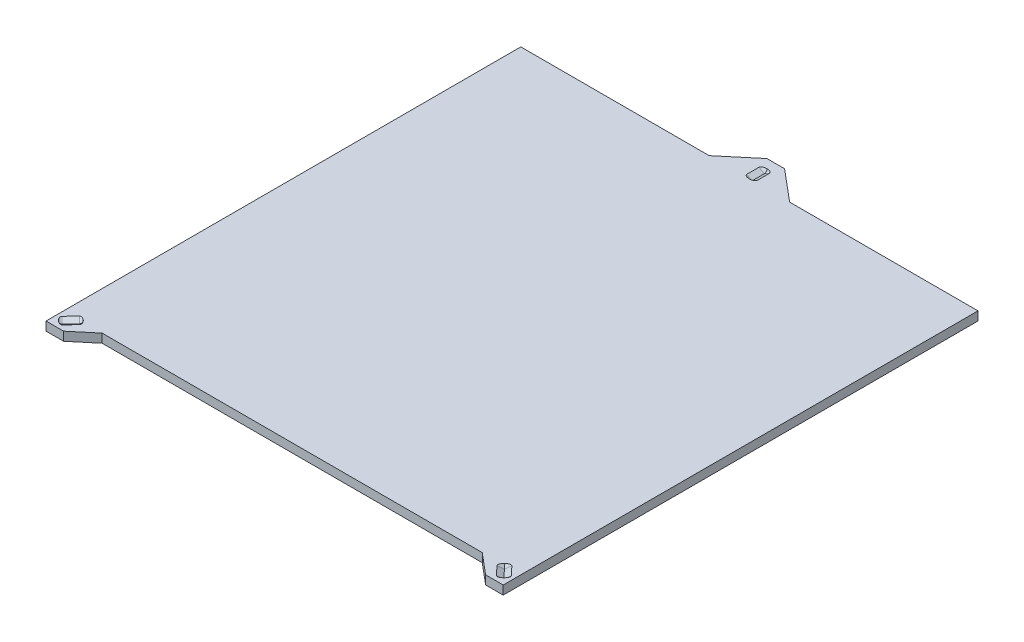
ISO-10303-21;
HEADER;
FILE_DESCRIPTION(('STEP AP214'),'2;1');
FILE_NAME('part.step','',(''),(''),'','','');
FILE_SCHEMA(('AUTOMOTIVE_DESIGN { 1 0 10303 214 1 1 1 1 }'));
ENDSEC;
DATA;
#1=APPLICATION_CONTEXT('core data for automotive mechanical design processes');
#2=APPLICATION_PROTOCOL_DEFINITION('international standard','automotive_design',2000,#1);
#3=PRODUCT_CONTEXT('',#1,'mechanical');
#4=PRODUCT('Part','Part','',(#3));
#5=PRODUCT_RELATED_PRODUCT_CATEGORY('part','',(#4));
#6=PRODUCT_DEFINITION_FORMATION('','',#4);
#7=PRODUCT_DEFINITION_CONTEXT('part definition',#1,'design');
#8=PRODUCT_DEFINITION('design','',#6,#7);
#9=PRODUCT_DEFINITION_SHAPE('','',#8);
#10=(LENGTH_UNIT() NAMED_UNIT(*) SI_UNIT(.MILLI.,.METRE.));
#11=(NAMED_UNIT(*) PLANE_ANGLE_UNIT() SI_UNIT($,.RADIAN.));
#12=(NAMED_UNIT(*) SI_UNIT($,.STERADIAN.) SOLID_ANGLE_UNIT());
#13=UNCERTAINTY_MEASURE_WITH_UNIT(LENGTH_MEASURE(1.E-05),#10,'distance_accuracy_value','');
#14=(GEOMETRIC_REPRESENTATION_CONTEXT(3) GLOBAL_UNCERTAINTY_ASSIGNED_CONTEXT((#13)) GLOBAL_UNIT_ASSIGNED_CONTEXT((#10,
#11,#12)) REPRESENTATION_CONTEXT('',''));
#15=CARTESIAN_POINT('',(0.,0.,0.));
#16=DIRECTION('',(0.,0.,1.));
#17=DIRECTION('',(1.,0.,0.));
#18=AXIS2_PLACEMENT_3D('',#15,#16,#17);
#19=CARTESIAN_POINT('',(0.,10.,0.));
#20=DIRECTION('',(0.,1.,0.));
#21=DIRECTION('',(0.,0.,1.));
#22=AXIS2_PLACEMENT_3D('',#19,#20,#21);
#23=PLANE('',#22);
#24=DIRECTION('',(0.,0.,1.));
#25=VECTOR('',#24,1.);
#26=CARTESIAN_POINT('',(-260.,10.,-260.));
#27=LINE('',#26,#25);
#28=CARTESIAN_POINT('',(-260.,10.,-260.));
#29=VERTEX_POINT('',#28);
#30=CARTESIAN_POINT('',(-260.,10.,280.));
#31=VERTEX_POINT('',#30);
#32=EDGE_CURVE('E192',#29,#31,#27,.T.);
#33=ORIENTED_EDGE('',*,*,#32,.T.);
#34=DIRECTION('',(1.,0.,0.));
#35=VECTOR('',#34,1.);
#36=CARTESIAN_POINT('',(-260.,10.,280.));
#37=LINE('',#36,#35);
#38=CARTESIAN_POINT('',(-240.,10.,280.));
#39=VERTEX_POINT('',#38);
#40=EDGE_CURVE('E196',#31,#39,#37,.T.);
#41=ORIENTED_EDGE('',*,*,#40,.T.);
#42=DIRECTION('',(0.766044443118982,0.,-0.642787609686535));
#43=VECTOR('',#42,1.);
#44=CARTESIAN_POINT('',(-240.,10.,280.));
#45=LINE('',#44,#43);
#46=CARTESIAN_POINT('',(-216.164928148116,10.,260.));
#47=VERTEX_POINT('',#46);
#48=EDGE_CURVE('E217',#39,#47,#45,.T.);
#49=ORIENTED_EDGE('',*,*,#48,.T.);
#50=DIRECTION('',(1.,0.,0.));
#51=VECTOR('',#50,1.);
#52=CARTESIAN_POINT('',(216.164928148116,10.,260.));
#53=LINE('',#52,#51);
#54=CARTESIAN_POINT('',(216.164928148116,10.,260.));
#55=VERTEX_POINT('',#54);
#56=EDGE_CURVE('E219',#47,#55,#53,.T.);
#57=ORIENTED_EDGE('',*,*,#56,.T.);
#58=DIRECTION('',(0.766044443118977,0.,0.642787609686541));
#59=VECTOR('',#58,1.);
#60=CARTESIAN_POINT('',(240.,10.,280.));
#61=LINE('',#60,#59);
#62=CARTESIAN_POINT('',(240.,10.,280.));
#63=VERTEX_POINT('',#62);
#64=EDGE_CURVE('E224',#55,#63,#61,.T.);
#65=ORIENTED_EDGE('',*,*,#64,.T.);
#66=DIRECTION('',(1.,0.,0.));
#67=VECTOR('',#66,1.);
#68=CARTESIAN_POINT('',(260.,10.,280.));
#69=LINE('',#68,#67);
#70=CARTESIAN_POINT('',(260.,10.,280.));
#71=VERTEX_POINT('',#70);
#72=EDGE_CURVE('E226',#63,#71,#69,.T.);
#73=ORIENTED_EDGE('',*,*,#72,.T.);
#74=DIRECTION('',(0.,0.,-1.));
#75=VECTOR('',#74,1.);
#76=CARTESIAN_POINT('',(260.,10.,260.));
#77=LINE('',#76,#75);
#78=CARTESIAN_POINT('',(260.,10.,-260.));
#79=VERTEX_POINT('',#78);
#80=EDGE_CURVE('E228',#71,#79,#77,.T.);
#81=ORIENTED_EDGE('',*,*,#80,.T.);
#82=DIRECTION('',(-1.,0.,0.));
#83=VECTOR('',#82,1.);
#84=CARTESIAN_POINT('',(260.,10.,-260.));
#85=LINE('',#84,#83);
#86=CARTESIAN_POINT('',(45.7526077778267,10.,-260.));
#87=VERTEX_POINT('',#86);
#88=EDGE_CURVE('E230',#79,#87,#85,.T.);
#89=ORIENTED_EDGE('',*,*,#88,.T.);
#90=DIRECTION('',(-0.766044443118982,0.,-0.642787609686534));
#91=VECTOR('',#90,1.);
#92=CARTESIAN_POINT('',(9.99999999999998,10.,-290.));
#93=LINE('',#92,#91);
#94=CARTESIAN_POINT('',(9.99999999999998,10.,-290.));
#95=VERTEX_POINT('',#94);
#96=EDGE_CURVE('E232',#87,#95,#93,.T.);
#97=ORIENTED_EDGE('',*,*,#96,.T.);
#98=DIRECTION('',(-1.,0.,0.));
#99=VECTOR('',#98,1.);
#100=CARTESIAN_POINT('',(-10.,10.,-290.));
#101=LINE('',#100,#99);
#102=CARTESIAN_POINT('',(-10.,10.,-290.));
#103=VERTEX_POINT('',#102);
#104=EDGE_CURVE('E234',#95,#103,#101,.T.);
#105=ORIENTED_EDGE('',*,*,#104,.T.);
#106=DIRECTION('',(-0.766044443118981,0.,0.642787609686536));
#107=VECTOR('',#106,1.);
#108=CARTESIAN_POINT('',(-45.7526077778267,10.,-260.));
#109=LINE('',#108,#107);
#110=CARTESIAN_POINT('',(-45.7526077778267,10.,-260.));
#111=VERTEX_POINT('',#110);
#112=EDGE_CURVE('E236',#103,#111,#109,.T.);
#113=ORIENTED_EDGE('',*,*,#112,.T.);
#114=DIRECTION('',(-1.,0.,0.));
#115=VECTOR('',#114,1.);
#116=CARTESIAN_POINT('',(-45.7526077778267,10.,-260.));
#117=LINE('',#116,#115);
#118=EDGE_CURVE('E199',#111,#29,#117,.T.);
#119=ORIENTED_EDGE('',*,*,#118,.T.);
#120=EDGE_LOOP('',(#33,#41,#49,#57,#65,#73,#81,#89,#97,#105,#113,#119));
#121=FACE_BOUND('',#120,.T.);
#122=CARTESIAN_POINT('',(-241.627820317084,10.,260.214575726089));
#123=DIRECTION('',(0.,1.,0.));
#124=DIRECTION('',(0.732793491626296,0.,0.680451099367282));
#125=AXIS2_PLACEMENT_3D('',#122,#123,#124);
#126=ELLIPSE('',#125,5.99999999999999,3.);
#127=CARTESIAN_POINT('',(-246.024581266842,10.,256.131869129885));
#128=VERTEX_POINT('',#127);
#129=CARTESIAN_POINT('',(-239.586467018983,10.,258.01619525121));
#130=VERTEX_POINT('',#129);
#131=EDGE_CURVE('E303',#128,#130,#126,.F.);
#132=ORIENTED_EDGE('',*,*,#131,.T.);
#133=CARTESIAN_POINT('',(-241.627820317084,10.,260.214575726089));
#134=DIRECTION('',(0.,1.,0.));
#135=DIRECTION('',(0.732793491626298,0.,0.680451099367279));
#136=AXIS2_PLACEMENT_3D('',#133,#134,#135);
#137=ELLIPSE('',#136,6.,3.);
#138=CARTESIAN_POINT('',(-237.231059367327,10.,264.297282322293));
#139=VERTEX_POINT('',#138);
#140=EDGE_CURVE('E305',#130,#139,#137,.F.);
#141=ORIENTED_EDGE('',*,*,#140,.T.);
#142=DIRECTION('',(-0.68045109936728,0.,0.732793491626297));
#143=VECTOR('',#142,1.);
#144=CARTESIAN_POINT('',(-235.189706069225,10.,262.098901847414));
#145=LINE('',#144,#143);
#146=CARTESIAN_POINT('',(-246.757374758469,10.,274.556391205061));
#147=VERTEX_POINT('',#146);
#148=EDGE_CURVE('E402',#139,#147,#145,.T.);
#149=ORIENTED_EDGE('',*,*,#148,.T.);
#150=CARTESIAN_POINT('',(-251.154135708226,10.,270.473684608857));
#151=DIRECTION('',(0.,1.,0.));
#152=DIRECTION('',(-0.732793491626298,0.,-0.680451099367279));
#153=AXIS2_PLACEMENT_3D('',#150,#151,#152);
#154=ELLIPSE('',#153,6.,3.);
#155=CARTESIAN_POINT('',(-253.195489006328,10.,272.672065083736));
#156=VERTEX_POINT('',#155);
#157=EDGE_CURVE('E307',#147,#156,#154,.F.);
#158=ORIENTED_EDGE('',*,*,#157,.T.);
#159=CARTESIAN_POINT('',(-251.154135708226,10.,270.473684608857));
#160=DIRECTION('',(0.,1.,0.));
#161=DIRECTION('',(-0.732793491626296,0.,-0.680451099367282));
#162=AXIS2_PLACEMENT_3D('',#159,#160,#161);
#163=ELLIPSE('',#162,5.99999999999999,3.);
#164=CARTESIAN_POINT('',(-255.550896657984,10.,266.390978012654));
#165=VERTEX_POINT('',#164);
#166=EDGE_CURVE('E309',#156,#165,#163,.F.);
#167=ORIENTED_EDGE('',*,*,#166,.T.);
#168=DIRECTION('',(-0.68045109936728,0.,0.732793491626297));
#169=VECTOR('',#168,1.);
#170=CARTESIAN_POINT('',(-243.98322796874,10.,253.933488655006));
#171=LINE('',#170,#169);
#172=EDGE_CURVE('E242',#128,#165,#171,.T.);
#173=ORIENTED_EDGE('',*,*,#172,.F.);
#174=EDGE_LOOP('',(#132,#141,#149,#158,#167,#173));
#175=FACE_BOUND('',#174,.T.);
#176=DIRECTION('',(0.68045109936728,0.,0.732793491626297));
#177=VECTOR('',#176,1.);
#178=CARTESIAN_POINT('',(235.189706069225,10.,262.098901847414));
#179=LINE('',#178,#177);
#180=CARTESIAN_POINT('',(237.231059367327,10.,264.297282322293));
#181=VERTEX_POINT('',#180);
#182=CARTESIAN_POINT('',(246.757374758469,10.,274.556391205061));
#183=VERTEX_POINT('',#182);
#184=EDGE_CURVE('E395',#181,#183,#179,.T.);
#185=ORIENTED_EDGE('',*,*,#184,.F.);
#186=CARTESIAN_POINT('',(241.627820317084,10.,260.214575726089));
#187=DIRECTION('',(0.,1.,0.));
#188=DIRECTION('',(0.732793491626298,0.,-0.680451099367279));
#189=AXIS2_PLACEMENT_3D('',#186,#187,#188);
#190=ELLIPSE('',#189,6.,3.);
#191=CARTESIAN_POINT('',(239.586467018983,9.99999999999999,258.01619525121));
#192=VERTEX_POINT('',#191);
#193=EDGE_CURVE('E331',#181,#192,#190,.F.);
#194=ORIENTED_EDGE('',*,*,#193,.T.);
#195=CARTESIAN_POINT('',(241.627820317084,10.,260.214575726089));
#196=DIRECTION('',(0.,1.,0.));
#197=DIRECTION('',(0.732793491626296,0.,-0.680451099367282));
#198=AXIS2_PLACEMENT_3D('',#195,#196,#197);
#199=ELLIPSE('',#198,5.99999999999999,3.);
#200=CARTESIAN_POINT('',(246.024581266842,10.,256.131869129885));
#201=VERTEX_POINT('',#200);
#202=EDGE_CURVE('E329',#192,#201,#199,.F.);
#203=ORIENTED_EDGE('',*,*,#202,.T.);
#204=DIRECTION('',(0.68045109936728,0.,0.732793491626297));
#205=VECTOR('',#204,1.);
#206=CARTESIAN_POINT('',(243.98322796874,10.,253.933488655006));
#207=LINE('',#206,#205);
#208=CARTESIAN_POINT('',(255.550896657984,10.,266.390978012653));
#209=VERTEX_POINT('',#208);
#210=EDGE_CURVE('E340',#201,#209,#207,.T.);
#211=ORIENTED_EDGE('',*,*,#210,.T.);
#212=CARTESIAN_POINT('',(251.154135708226,10.,270.473684608857));
#213=DIRECTION('',(0.,1.,0.));
#214=DIRECTION('',(-0.732793491626296,0.,0.680451099367282));
#215=AXIS2_PLACEMENT_3D('',#212,#213,#214);
#216=ELLIPSE('',#215,5.99999999999999,3.);
#217=CARTESIAN_POINT('',(253.195489006328,10.,272.672065083736));
#218=VERTEX_POINT('',#217);
#219=EDGE_CURVE('E335',#209,#218,#216,.F.);
#220=ORIENTED_EDGE('',*,*,#219,.T.);
#221=CARTESIAN_POINT('',(251.154135708226,10.,270.473684608857));
#222=DIRECTION('',(0.,1.,0.));
#223=DIRECTION('',(-0.732793491626298,0.,0.680451099367279));
#224=AXIS2_PLACEMENT_3D('',#221,#222,#223);
#225=ELLIPSE('',#224,6.,3.);
#226=EDGE_CURVE('E333',#218,#183,#225,.F.);
#227=ORIENTED_EDGE('',*,*,#226,.T.);
#228=EDGE_LOOP('',(#185,#194,#203,#211,#220,#227));
#229=FACE_BOUND('',#228,.T.);
#230=CARTESIAN_POINT('',(0.,10.,-263.));
#231=DIRECTION('',(0.,1.,0.));
#232=DIRECTION('',(-1.,0.,0.));
#233=AXIS2_PLACEMENT_3D('',#230,#231,#232);
#234=ELLIPSE('',#233,6.00000000000006,3.);
#235=CARTESIAN_POINT('',(6.,10.,-263.));
#236=VERTEX_POINT('',#235);
#237=CARTESIAN_POINT('',(0.,10.,-260.));
#238=VERTEX_POINT('',#237);
#239=EDGE_CURVE('E54',#236,#238,#234,.F.);
#240=ORIENTED_EDGE('',*,*,#239,.T.);
#241=CARTESIAN_POINT('',(0.,10.,-263.));
#242=DIRECTION('',(0.,1.,0.));
#243=DIRECTION('',(-1.,0.,0.));
#244=AXIS2_PLACEMENT_3D('',#241,#242,#243);
#245=ELLIPSE('',#244,6.00000000000006,3.);
#246=CARTESIAN_POINT('',(-6.,10.,-263.));
#247=VERTEX_POINT('',#246);
#248=EDGE_CURVE('E354',#238,#247,#245,.F.);
#249=ORIENTED_EDGE('',*,*,#248,.T.);
#250=DIRECTION('',(0.,0.,-1.));
#251=VECTOR('',#250,1.);
#252=CARTESIAN_POINT('',(-6.,10.,-260.));
#253=LINE('',#252,#251);
#254=CARTESIAN_POINT('',(-6.,10.,-277.));
#255=VERTEX_POINT('',#254);
#256=EDGE_CURVE('E363',#247,#255,#253,.T.);
#257=ORIENTED_EDGE('',*,*,#256,.T.);
#258=CARTESIAN_POINT('',(0.,10.,-277.));
#259=DIRECTION('',(0.,1.,0.));
#260=DIRECTION('',(1.,0.,0.));
#261=AXIS2_PLACEMENT_3D('',#258,#259,#260);
#262=ELLIPSE('',#261,6.00000000000006,3.);
#263=CARTESIAN_POINT('',(0.,10.,-280.));
#264=VERTEX_POINT('',#263);
#265=EDGE_CURVE('E11',#255,#264,#262,.F.);
#266=ORIENTED_EDGE('',*,*,#265,.T.);
#267=CARTESIAN_POINT('',(0.,10.,-277.));
#268=DIRECTION('',(0.,1.,0.));
#269=DIRECTION('',(1.,0.,0.));
#270=AXIS2_PLACEMENT_3D('',#267,#268,#269);
#271=ELLIPSE('',#270,6.00000000000006,3.);
#272=CARTESIAN_POINT('',(6.,10.,-277.));
#273=VERTEX_POINT('',#272);
#274=EDGE_CURVE('E41',#264,#273,#271,.F.);
#275=ORIENTED_EDGE('',*,*,#274,.T.);
#276=DIRECTION('',(0.,0.,-1.));
#277=VECTOR('',#276,1.);
#278=CARTESIAN_POINT('',(6.,10.,-260.));
#279=LINE('',#278,#277);
#280=EDGE_CURVE('E343',#236,#273,#279,.T.);
#281=ORIENTED_EDGE('',*,*,#280,.F.);
#282=EDGE_LOOP('',(#240,#249,#257,#266,#275,#281));
#283=FACE_BOUND('',#282,.T.);
#284=ADVANCED_FACE('F32',(#121,#175,#229,#283),#23,.T.);
#285=CARTESIAN_POINT('',(-260.,10.,260.));
#286=DIRECTION('',(1.,0.,0.));
#287=DIRECTION('',(0.,0.,-1.));
#288=AXIS2_PLACEMENT_3D('',#285,#286,#287);
#289=PLANE('',#288);
#290=DIRECTION('',(0.,0.,1.));
#291=VECTOR('',#290,1.);
#292=CARTESIAN_POINT('',(-260.,0.,260.));
#293=LINE('',#292,#291);
#294=CARTESIAN_POINT('',(-260.,0.,-260.));
#295=VERTEX_POINT('',#294);
#296=CARTESIAN_POINT('',(-260.,0.,280.));
#297=VERTEX_POINT('',#296);
#298=EDGE_CURVE('E208',#295,#297,#293,.T.);
#299=ORIENTED_EDGE('',*,*,#298,.T.);
#300=DIRECTION('',(0.,-1.,0.));
#301=VECTOR('',#300,1.);
#302=CARTESIAN_POINT('',(-260.,10.,280.));
#303=LINE('',#302,#301);
#304=EDGE_CURVE('E206',#31,#297,#303,.T.);
#305=ORIENTED_EDGE('',*,*,#304,.F.);
#306=ORIENTED_EDGE('',*,*,#32,.F.);
#307=DIRECTION('',(0.,-1.,0.));
#308=VECTOR('',#307,1.);
#309=CARTESIAN_POINT('',(-260.,10.,-260.));
#310=LINE('',#309,#308);
#311=EDGE_CURVE('E239',#29,#295,#310,.T.);
#312=ORIENTED_EDGE('',*,*,#311,.T.);
#313=EDGE_LOOP('',(#299,#305,#306,#312));
#314=FACE_BOUND('',#313,.T.);
#315=ADVANCED_FACE('F207',(#314),#289,.F.);
#316=CARTESIAN_POINT('',(-260.,10.,280.));
#317=DIRECTION('',(0.,0.,-1.));
#318=DIRECTION('',(-1.,0.,0.));
#319=AXIS2_PLACEMENT_3D('',#316,#317,#318);
#320=PLANE('',#319);
#321=DIRECTION('',(1.,0.,0.));
#322=VECTOR('',#321,1.);
#323=CARTESIAN_POINT('',(-260.,0.,280.));
#324=LINE('',#323,#322);
#325=CARTESIAN_POINT('',(-240.,0.,280.));
#326=VERTEX_POINT('',#325);
#327=EDGE_CURVE('E241',#297,#326,#324,.T.);
#328=ORIENTED_EDGE('',*,*,#327,.T.);
#329=DIRECTION('',(0.,-1.,0.));
#330=VECTOR('',#329,1.);
#331=CARTESIAN_POINT('',(-240.,10.,280.));
#332=LINE('',#331,#330);
#333=EDGE_CURVE('E212',#39,#326,#332,.T.);
#334=ORIENTED_EDGE('',*,*,#333,.F.);
#335=ORIENTED_EDGE('',*,*,#40,.F.);
#336=ORIENTED_EDGE('',*,*,#304,.T.);
#337=EDGE_LOOP('',(#328,#334,#335,#336));
#338=FACE_BOUND('',#337,.T.);
#339=ADVANCED_FACE('F214',(#338),#320,.F.);
#340=CARTESIAN_POINT('',(-240.,10.,280.));
#341=DIRECTION('',(-0.642787609686535,0.,-0.766044443118982));
#342=DIRECTION('',(-0.766044443118982,0.,0.642787609686535));
#343=AXIS2_PLACEMENT_3D('',#340,#341,#342);
#344=PLANE('',#343);
#345=DIRECTION('',(0.766044443118982,0.,-0.642787609686535));
#346=VECTOR('',#345,1.);
#347=CARTESIAN_POINT('',(-240.,0.,280.));
#348=LINE('',#347,#346);
#349=CARTESIAN_POINT('',(-216.164928148116,0.,260.));
#350=VERTEX_POINT('',#349);
#351=EDGE_CURVE('E244',#326,#350,#348,.T.);
#352=ORIENTED_EDGE('',*,*,#351,.T.);
#353=DIRECTION('',(0.,-1.,0.));
#354=VECTOR('',#353,1.);
#355=CARTESIAN_POINT('',(-216.164928148116,10.,260.));
#356=LINE('',#355,#354);
#357=EDGE_CURVE('E290',#47,#350,#356,.T.);
#358=ORIENTED_EDGE('',*,*,#357,.F.);
#359=ORIENTED_EDGE('',*,*,#48,.F.);
#360=ORIENTED_EDGE('',*,*,#333,.T.);
#361=EDGE_LOOP('',(#352,#358,#359,#360));
#362=FACE_BOUND('',#361,.T.);
#363=ADVANCED_FACE('F485',(#362),#344,.F.);
#364=CARTESIAN_POINT('',(216.164928148116,10.,260.));
#365=DIRECTION('',(0.,0.,-1.));
#366=DIRECTION('',(-1.,0.,0.));
#367=AXIS2_PLACEMENT_3D('',#364,#365,#366);
#368=PLANE('',#367);
#369=DIRECTION('',(1.,0.,0.));
#370=VECTOR('',#369,1.);
#371=CARTESIAN_POINT('',(216.164928148116,0.,260.));
#372=LINE('',#371,#370);
#373=CARTESIAN_POINT('',(216.164928148116,0.,260.));
#374=VERTEX_POINT('',#373);
#375=EDGE_CURVE('E246',#350,#374,#372,.T.);
#376=ORIENTED_EDGE('',*,*,#375,.T.);
#377=DIRECTION('',(0.,-1.,0.));
#378=VECTOR('',#377,1.);
#379=CARTESIAN_POINT('',(216.164928148116,10.,260.));
#380=LINE('',#379,#378);
#381=EDGE_CURVE('E287',#55,#374,#380,.T.);
#382=ORIENTED_EDGE('',*,*,#381,.F.);
#383=ORIENTED_EDGE('',*,*,#56,.F.);
#384=ORIENTED_EDGE('',*,*,#357,.T.);
#385=EDGE_LOOP('',(#376,#382,#383,#384));
#386=FACE_BOUND('',#385,.T.);
#387=ADVANCED_FACE('F481',(#386),#368,.F.);
#388=CARTESIAN_POINT('',(240.,10.,280.));
#389=DIRECTION('',(0.642787609686541,0.,-0.766044443118977));
#390=DIRECTION('',(-0.766044443118977,0.,-0.642787609686541));
#391=AXIS2_PLACEMENT_3D('',#388,#389,#390);
#392=PLANE('',#391);
#393=DIRECTION('',(0.766044443118977,0.,0.642787609686541));
#394=VECTOR('',#393,1.);
#395=CARTESIAN_POINT('',(240.,0.,280.));
#396=LINE('',#395,#394);
#397=CARTESIAN_POINT('',(240.,0.,280.));
#398=VERTEX_POINT('',#397);
#399=EDGE_CURVE('E248',#374,#398,#396,.T.);
#400=ORIENTED_EDGE('',*,*,#399,.T.);
#401=DIRECTION('',(0.,-1.,0.));
#402=VECTOR('',#401,1.);
#403=CARTESIAN_POINT('',(240.,10.,280.));
#404=LINE('',#403,#402);
#405=EDGE_CURVE('E284',#63,#398,#404,.T.);
#406=ORIENTED_EDGE('',*,*,#405,.F.);
#407=ORIENTED_EDGE('',*,*,#64,.F.);
#408=ORIENTED_EDGE('',*,*,#381,.T.);
#409=EDGE_LOOP('',(#400,#406,#407,#408));
#410=FACE_BOUND('',#409,.T.);
#411=ADVANCED_FACE('F477',(#410),#392,.F.);
#412=CARTESIAN_POINT('',(260.,10.,280.));
#413=DIRECTION('',(0.,0.,-1.));
#414=DIRECTION('',(-1.,0.,0.));
#415=AXIS2_PLACEMENT_3D('',#412,#413,#414);
#416=PLANE('',#415);
#417=DIRECTION('',(1.,0.,0.));
#418=VECTOR('',#417,1.);
#419=CARTESIAN_POINT('',(260.,0.,280.));
#420=LINE('',#419,#418);
#421=CARTESIAN_POINT('',(260.,0.,280.));
#422=VERTEX_POINT('',#421);
#423=EDGE_CURVE('E250',#398,#422,#420,.T.);
#424=ORIENTED_EDGE('',*,*,#423,.T.);
#425=DIRECTION('',(0.,-1.,0.));
#426=VECTOR('',#425,1.);
#427=CARTESIAN_POINT('',(260.,10.,280.));
#428=LINE('',#427,#426);
#429=EDGE_CURVE('E281',#71,#422,#428,.T.);
#430=ORIENTED_EDGE('',*,*,#429,.F.);
#431=ORIENTED_EDGE('',*,*,#72,.F.);
#432=ORIENTED_EDGE('',*,*,#405,.T.);
#433=EDGE_LOOP('',(#424,#430,#431,#432));
#434=FACE_BOUND('',#433,.T.);
#435=ADVANCED_FACE('F473',(#434),#416,.F.);
#436=CARTESIAN_POINT('',(260.,10.,-260.));
#437=DIRECTION('',(-1.,0.,0.));
#438=DIRECTION('',(0.,0.,1.));
#439=AXIS2_PLACEMENT_3D('',#436,#437,#438);
#440=PLANE('',#439);
#441=DIRECTION('',(0.,0.,-1.));
#442=VECTOR('',#441,1.);
#443=CARTESIAN_POINT('',(260.,0.,-260.));
#444=LINE('',#443,#442);
#445=CARTESIAN_POINT('',(260.,0.,-260.));
#446=VERTEX_POINT('',#445);
#447=EDGE_CURVE('E253',#422,#446,#444,.T.);
#448=ORIENTED_EDGE('',*,*,#447,.T.);
#449=DIRECTION('',(0.,-1.,0.));
#450=VECTOR('',#449,1.);
#451=CARTESIAN_POINT('',(260.,10.,-260.));
#452=LINE('',#451,#450);
#453=EDGE_CURVE('E278',#79,#446,#452,.T.);
#454=ORIENTED_EDGE('',*,*,#453,.F.);
#455=ORIENTED_EDGE('',*,*,#80,.F.);
#456=ORIENTED_EDGE('',*,*,#429,.T.);
#457=EDGE_LOOP('',(#448,#454,#455,#456));
#458=FACE_BOUND('',#457,.T.);
#459=ADVANCED_FACE('F469',(#458),#440,.F.);
#460=CARTESIAN_POINT('',(260.,10.,-260.));
#461=DIRECTION('',(0.,0.,1.));
#462=DIRECTION('',(1.,0.,0.));
#463=AXIS2_PLACEMENT_3D('',#460,#461,#462);
#464=PLANE('',#463);
#465=DIRECTION('',(-1.,0.,0.));
#466=VECTOR('',#465,1.);
#467=CARTESIAN_POINT('',(260.,0.,-260.));
#468=LINE('',#467,#466);
#469=CARTESIAN_POINT('',(45.7526077778267,0.,-260.));
#470=VERTEX_POINT('',#469);
#471=EDGE_CURVE('E255',#446,#470,#468,.T.);
#472=ORIENTED_EDGE('',*,*,#471,.T.);
#473=DIRECTION('',(0.,-1.,0.));
#474=VECTOR('',#473,1.);
#475=CARTESIAN_POINT('',(45.7526077778267,10.,-260.));
#476=LINE('',#475,#474);
#477=EDGE_CURVE('E275',#87,#470,#476,.T.);
#478=ORIENTED_EDGE('',*,*,#477,.F.);
#479=ORIENTED_EDGE('',*,*,#88,.F.);
#480=ORIENTED_EDGE('',*,*,#453,.T.);
#481=EDGE_LOOP('',(#472,#478,#479,#480));
#482=FACE_BOUND('',#481,.T.);
#483=ADVANCED_FACE('F465',(#482),#464,.F.);
#484=CARTESIAN_POINT('',(9.99999999999998,10.,-290.));
#485=DIRECTION('',(-0.642787609686534,0.,0.766044443118982));
#486=DIRECTION('',(0.766044443118982,0.,0.642787609686534));
#487=AXIS2_PLACEMENT_3D('',#484,#485,#486);
#488=PLANE('',#487);
#489=DIRECTION('',(-0.766044443118982,0.,-0.642787609686534));
#490=VECTOR('',#489,1.);
#491=CARTESIAN_POINT('',(9.99999999999998,0.,-290.));
#492=LINE('',#491,#490);
#493=CARTESIAN_POINT('',(9.99999999999998,0.,-290.));
#494=VERTEX_POINT('',#493);
#495=EDGE_CURVE('E257',#470,#494,#492,.T.);
#496=ORIENTED_EDGE('',*,*,#495,.T.);
#497=DIRECTION('',(0.,-1.,0.));
#498=VECTOR('',#497,1.);
#499=CARTESIAN_POINT('',(9.99999999999998,10.,-290.));
#500=LINE('',#499,#498);
#501=EDGE_CURVE('E272',#95,#494,#500,.T.);
#502=ORIENTED_EDGE('',*,*,#501,.F.);
#503=ORIENTED_EDGE('',*,*,#96,.F.);
#504=ORIENTED_EDGE('',*,*,#477,.T.);
#505=EDGE_LOOP('',(#496,#502,#503,#504));
#506=FACE_BOUND('',#505,.T.);
#507=ADVANCED_FACE('F461',(#506),#488,.F.);
#508=CARTESIAN_POINT('',(-10.,10.,-290.));
#509=DIRECTION('',(0.,0.,1.));
#510=DIRECTION('',(1.,0.,0.));
#511=AXIS2_PLACEMENT_3D('',#508,#509,#510);
#512=PLANE('',#511);
#513=DIRECTION('',(-1.,0.,0.));
#514=VECTOR('',#513,1.);
#515=CARTESIAN_POINT('',(-10.,0.,-290.));
#516=LINE('',#515,#514);
#517=CARTESIAN_POINT('',(-10.,0.,-290.));
#518=VERTEX_POINT('',#517);
#519=EDGE_CURVE('E259',#494,#518,#516,.T.);
#520=ORIENTED_EDGE('',*,*,#519,.T.);
#521=DIRECTION('',(0.,-1.,0.));
#522=VECTOR('',#521,1.);
#523=CARTESIAN_POINT('',(-10.,10.,-290.));
#524=LINE('',#523,#522);
#525=EDGE_CURVE('E269',#103,#518,#524,.T.);
#526=ORIENTED_EDGE('',*,*,#525,.F.);
#527=ORIENTED_EDGE('',*,*,#104,.F.);
#528=ORIENTED_EDGE('',*,*,#501,.T.);
#529=EDGE_LOOP('',(#520,#526,#527,#528));
#530=FACE_BOUND('',#529,.T.);
#531=ADVANCED_FACE('F457',(#530),#512,.F.);
#532=CARTESIAN_POINT('',(-45.7526077778267,10.,-260.));
#533=DIRECTION('',(0.642787609686536,0.,0.766044443118981));
#534=DIRECTION('',(0.766044443118981,0.,-0.642787609686536));
#535=AXIS2_PLACEMENT_3D('',#532,#533,#534);
#536=PLANE('',#535);
#537=DIRECTION('',(-0.766044443118981,0.,0.642787609686536));
#538=VECTOR('',#537,1.);
#539=CARTESIAN_POINT('',(-45.7526077778267,0.,-260.));
#540=LINE('',#539,#538);
#541=CARTESIAN_POINT('',(-45.7526077778267,0.,-260.));
#542=VERTEX_POINT('',#541);
#543=EDGE_CURVE('E261',#518,#542,#540,.T.);
#544=ORIENTED_EDGE('',*,*,#543,.T.);
#545=DIRECTION('',(0.,-1.,0.));
#546=VECTOR('',#545,1.);
#547=CARTESIAN_POINT('',(-45.7526077778267,10.,-260.));
#548=LINE('',#547,#546);
#549=EDGE_CURVE('E266',#111,#542,#548,.T.);
#550=ORIENTED_EDGE('',*,*,#549,.F.);
#551=ORIENTED_EDGE('',*,*,#112,.F.);
#552=ORIENTED_EDGE('',*,*,#525,.T.);
#553=EDGE_LOOP('',(#544,#550,#551,#552));
#554=FACE_BOUND('',#553,.T.);
#555=ADVANCED_FACE('F453',(#554),#536,.F.);
#556=CARTESIAN_POINT('',(-45.7526077778267,10.,-260.));
#557=DIRECTION('',(0.,0.,1.));
#558=DIRECTION('',(1.,0.,0.));
#559=AXIS2_PLACEMENT_3D('',#556,#557,#558);
#560=PLANE('',#559);
#561=DIRECTION('',(-1.,0.,0.));
#562=VECTOR('',#561,1.);
#563=CARTESIAN_POINT('',(-45.7526077778267,0.,-260.));
#564=LINE('',#563,#562);
#565=EDGE_CURVE('E203',#542,#295,#564,.T.);
#566=ORIENTED_EDGE('',*,*,#565,.T.);
#567=ORIENTED_EDGE('',*,*,#311,.F.);
#568=ORIENTED_EDGE('',*,*,#118,.F.);
#569=ORIENTED_EDGE('',*,*,#549,.T.);
#570=EDGE_LOOP('',(#566,#567,#568,#569));
#571=FACE_BOUND('',#570,.T.);
#572=ADVANCED_FACE('F449',(#571),#560,.F.);
#573=CARTESIAN_POINT('',(0.,0.,0.));
#574=DIRECTION('',(0.,1.,0.));
#575=DIRECTION('',(0.,0.,1.));
#576=AXIS2_PLACEMENT_3D('',#573,#574,#575);
#577=PLANE('',#576);
#578=CARTESIAN_POINT('',(-246.390978012655,0.,265.344130167473));
#579=DIRECTION('',(0.,-1.,0.));
#580=DIRECTION('',(0.,0.,-1.));
#581=AXIS2_PLACEMENT_3D('',#578,#579,#580);
#582=CIRCLE('',#581,6.25);
#583=CARTESIAN_POINT('',(-246.390978012655,0.,259.094130167473));
#584=VERTEX_POINT('',#583);
#585=EDGE_CURVE('E371',#584,#584,#582,.T.);
#586=ORIENTED_EDGE('',*,*,#585,.F.);
#587=EDGE_LOOP('',(#586));
#588=FACE_BOUND('',#587,.T.);
#589=CARTESIAN_POINT('',(246.390978012658,0.,265.344130167471));
#590=DIRECTION('',(0.,-1.,0.));
#591=DIRECTION('',(0.,0.,-1.));
#592=AXIS2_PLACEMENT_3D('',#589,#590,#591);
#593=CIRCLE('',#592,6.25000000000003);
#594=CARTESIAN_POINT('',(246.390978012658,0.,259.094130167471));
#595=VERTEX_POINT('',#594);
#596=EDGE_CURVE('E381',#595,#595,#593,.T.);
#597=ORIENTED_EDGE('',*,*,#596,.F.);
#598=EDGE_LOOP('',(#597));
#599=FACE_BOUND('',#598,.T.);
#600=CARTESIAN_POINT('',(0.,0.,-270.));
#601=DIRECTION('',(0.,-1.,0.));
#602=DIRECTION('',(0.,0.,-1.));
#603=AXIS2_PLACEMENT_3D('',#600,#601,#602);
#604=CIRCLE('',#603,6.25);
#605=CARTESIAN_POINT('',(0.,0.,-276.25));
#606=VERTEX_POINT('',#605);
#607=EDGE_CURVE('E387',#606,#606,#604,.T.);
#608=ORIENTED_EDGE('',*,*,#607,.F.);
#609=EDGE_LOOP('',(#608));
#610=FACE_BOUND('',#609,.T.);
#611=ORIENTED_EDGE('',*,*,#298,.F.);
#612=ORIENTED_EDGE('',*,*,#565,.F.);
#613=ORIENTED_EDGE('',*,*,#543,.F.);
#614=ORIENTED_EDGE('',*,*,#519,.F.);
#615=ORIENTED_EDGE('',*,*,#495,.F.);
#616=ORIENTED_EDGE('',*,*,#471,.F.);
#617=ORIENTED_EDGE('',*,*,#447,.F.);
#618=ORIENTED_EDGE('',*,*,#423,.F.);
#619=ORIENTED_EDGE('',*,*,#399,.F.);
#620=ORIENTED_EDGE('',*,*,#375,.F.);
#621=ORIENTED_EDGE('',*,*,#351,.F.);
#622=ORIENTED_EDGE('',*,*,#327,.F.);
#623=EDGE_LOOP('',(#611,#612,#613,#614,#615,#616,#617,#618,#619,#620,#621,#622));
#624=FACE_BOUND('',#623,.T.);
#625=ADVANCED_FACE('F446',(#588,#599,#610,#624),#577,.F.);
#626=CARTESIAN_POINT('',(-243.98322796874,10.,253.933488655006));
#627=DIRECTION('',(0.366396745813149,0.866025403784438,0.340225549683641));
#628=DIRECTION('',(-0.920966723424105,0.389641237993964,0.));
#629=AXIS2_PLACEMENT_3D('',#626,#627,#628);
#630=PLANE('',#629);
#631=DIRECTION('',(-0.68045109936728,0.,0.732793491626297));
#632=VECTOR('',#631,1.);
#633=CARTESIAN_POINT('',(-239.586467018983,6.53589838486224,258.01619525121));
#634=LINE('',#633,#632);
#635=CARTESIAN_POINT('',(-241.627820317084,6.53589838486224,260.214575726089));
#636=VERTEX_POINT('',#635);
#637=CARTESIAN_POINT('',(-251.154135708226,6.53589838486224,270.473684608857));
#638=VERTEX_POINT('',#637);
#639=EDGE_CURVE('E315',#636,#638,#634,.T.);
#640=ORIENTED_EDGE('',*,*,#639,.F.);
#641=DIRECTION('',(-0.634617779476271,0.500000000000001,-0.589287938085115));
#642=VECTOR('',#641,1.);
#643=CARTESIAN_POINT('',(-246.024581266842,10.,256.131869129885));
#644=LINE('',#643,#642);
#645=EDGE_CURVE('E295',#636,#128,#644,.T.);
#646=ORIENTED_EDGE('',*,*,#645,.T.);
#647=ORIENTED_EDGE('',*,*,#172,.T.);
#648=DIRECTION('',(-0.634617779476271,0.500000000000001,-0.589287938085115));
#649=VECTOR('',#648,1.);
#650=CARTESIAN_POINT('',(-255.550896657984,10.,266.390978012654));
#651=LINE('',#650,#649);
#652=EDGE_CURVE('E211',#165,#638,#651,.F.);
#653=ORIENTED_EDGE('',*,*,#652,.T.);
#654=EDGE_LOOP('',(#640,#646,#647,#653));
#655=FACE_BOUND('',#654,.T.);
#656=ADVANCED_FACE('F409',(#655),#630,.T.);
#657=CARTESIAN_POINT('',(-239.586467018983,6.53589838486224,258.01619525121));
#658=DIRECTION('',(-0.366396745813148,0.866025403784439,-0.34022554968364));
#659=DIRECTION('',(-0.920966723424105,-0.389641237993963,0.));
#660=AXIS2_PLACEMENT_3D('',#657,#658,#659);
#661=PLANE('',#660);
#662=ORIENTED_EDGE('',*,*,#148,.F.);
#663=DIRECTION('',(-0.634617779476273,-0.5,-0.589287938085113));
#664=VECTOR('',#663,1.);
#665=CARTESIAN_POINT('',(-241.627820317084,6.53589838486224,260.214575726089));
#666=LINE('',#665,#664);
#667=EDGE_CURVE('E301',#139,#636,#666,.T.);
#668=ORIENTED_EDGE('',*,*,#667,.T.);
#669=ORIENTED_EDGE('',*,*,#639,.T.);
#670=DIRECTION('',(-0.634617779476273,-0.5,-0.589287938085113));
#671=VECTOR('',#670,1.);
#672=CARTESIAN_POINT('',(-251.154135708226,6.53589838486225,270.473684608857));
#673=LINE('',#672,#671);
#674=EDGE_CURVE('E298',#638,#147,#673,.F.);
#675=ORIENTED_EDGE('',*,*,#674,.T.);
#676=EDGE_LOOP('',(#662,#668,#669,#675));
#677=FACE_BOUND('',#676,.T.);
#678=ADVANCED_FACE('F420',(#677),#661,.T.);
#679=CARTESIAN_POINT('',(-242.727010554524,9.13397459621555,259.193899077038));
#680=DIRECTION('',(0.634617779476273,0.5,0.589287938085113));
#681=DIRECTION('',(0.680451099367279,0.,-0.732793491626298));
#682=AXIS2_PLACEMENT_3D('',#679,#680,#681);
#683=CYLINDRICAL_SURFACE('',#682,3.);
#684=CARTESIAN_POINT('',(-241.627820317084,9.99999999999999,260.214575726089));
#685=DIRECTION('',(0.732793491626297,0.,0.680451099367281));
#686=DIRECTION('',(0.,-1.,0.));
#687=AXIS2_PLACEMENT_3D('',#684,#685,#686);
#688=ELLIPSE('',#687,3.46410161513776,3.);
#689=EDGE_CURVE('E312',#636,#130,#688,.T.);
#690=ORIENTED_EDGE('',*,*,#689,.F.);
#691=ORIENTED_EDGE('',*,*,#667,.F.);
#692=ORIENTED_EDGE('',*,*,#140,.F.);
#693=EDGE_LOOP('',(#690,#691,#692));
#694=FACE_BOUND('',#693,.T.);
#695=ADVANCED_FACE('F426',(#694),#683,.F.);
#696=CARTESIAN_POINT('',(-244.925391029403,12.5980762113533,257.152545778936));
#697=DIRECTION('',(0.634617779476271,-0.500000000000001,0.589287938085115));
#698=DIRECTION('',(0.680451099367282,0.,-0.732793491626296));
#699=AXIS2_PLACEMENT_3D('',#696,#697,#698);
#700=CYLINDRICAL_SURFACE('',#699,3.);
#701=ORIENTED_EDGE('',*,*,#645,.F.);
#702=ORIENTED_EDGE('',*,*,#689,.T.);
#703=ORIENTED_EDGE('',*,*,#131,.F.);
#704=EDGE_LOOP('',(#701,#702,#703));
#705=FACE_BOUND('',#704,.T.);
#706=ADVANCED_FACE('F428',(#705),#700,.F.);
#707=CARTESIAN_POINT('',(-247.981046810845,7.50000000000026,273.420124299282));
#708=DIRECTION('',(-0.634617779476271,0.500000000000001,-0.589287938085115));
#709=DIRECTION('',(-0.680451099367282,0.,0.732793491626296));
#710=AXIS2_PLACEMENT_3D('',#707,#708,#709);
#711=CYLINDRICAL_SURFACE('',#710,3.);
#712=ORIENTED_EDGE('',*,*,#652,.F.);
#713=ORIENTED_EDGE('',*,*,#166,.F.);
#714=CARTESIAN_POINT('',(-251.154135708226,9.99999999999999,270.473684608857));
#715=DIRECTION('',(-0.732793491626297,0.,-0.680451099367281));
#716=DIRECTION('',(0.,-1.,0.));
#717=AXIS2_PLACEMENT_3D('',#714,#715,#716);
#718=ELLIPSE('',#717,3.46410161513776,3.);
#719=EDGE_CURVE('E316',#638,#156,#718,.T.);
#720=ORIENTED_EDGE('',*,*,#719,.F.);
#721=EDGE_LOOP('',(#712,#713,#720));
#722=FACE_BOUND('',#721,.T.);
#723=ADVANCED_FACE('F414',(#722),#711,.F.);
#724=CARTESIAN_POINT('',(-254.327224605607,7.50000000000021,267.527244918432));
#725=DIRECTION('',(-0.634617779476273,-0.5,-0.589287938085113));
#726=DIRECTION('',(-0.680451099367279,0.,0.732793491626298));
#727=AXIS2_PLACEMENT_3D('',#724,#725,#726);
#728=CYLINDRICAL_SURFACE('',#727,3.);
#729=ORIENTED_EDGE('',*,*,#157,.F.);
#730=ORIENTED_EDGE('',*,*,#674,.F.);
#731=ORIENTED_EDGE('',*,*,#719,.T.);
#732=EDGE_LOOP('',(#729,#730,#731));
#733=FACE_BOUND('',#732,.T.);
#734=ADVANCED_FACE('F417',(#733),#728,.F.);
#735=CARTESIAN_POINT('',(243.98322796874,10.,253.933488655006));
#736=DIRECTION('',(0.366396745813149,-0.866025403784438,-0.340225549683641));
#737=DIRECTION('',(0.920966723424105,0.389641237993964,0.));
#738=AXIS2_PLACEMENT_3D('',#735,#736,#737);
#739=PLANE('',#738);
#740=ORIENTED_EDGE('',*,*,#210,.F.);
#741=DIRECTION('',(0.634617779476271,0.500000000000001,-0.589287938085115));
#742=VECTOR('',#741,1.);
#743=CARTESIAN_POINT('',(246.024581266842,10.,256.131869129885));
#744=LINE('',#743,#742);
#745=CARTESIAN_POINT('',(241.627820317084,6.53589838486224,260.214575726089));
#746=VERTEX_POINT('',#745);
#747=EDGE_CURVE('E321',#201,#746,#744,.F.);
#748=ORIENTED_EDGE('',*,*,#747,.T.);
#749=DIRECTION('',(0.68045109936728,0.,0.732793491626297));
#750=VECTOR('',#749,1.);
#751=CARTESIAN_POINT('',(239.586467018983,6.53589838486224,258.01619525121));
#752=LINE('',#751,#750);
#753=CARTESIAN_POINT('',(251.154135708226,6.53589838486224,270.473684608857));
#754=VERTEX_POINT('',#753);
#755=EDGE_CURVE('E319',#746,#754,#752,.T.);
#756=ORIENTED_EDGE('',*,*,#755,.T.);
#757=DIRECTION('',(0.634617779476271,0.500000000000001,-0.589287938085115));
#758=VECTOR('',#757,1.);
#759=CARTESIAN_POINT('',(255.550896657984,10.,266.390978012653));
#760=LINE('',#759,#758);
#761=EDGE_CURVE('E311',#754,#209,#760,.T.);
#762=ORIENTED_EDGE('',*,*,#761,.T.);
#763=EDGE_LOOP('',(#740,#748,#756,#762));
#764=FACE_BOUND('',#763,.T.);
#765=ADVANCED_FACE('F574',(#764),#739,.F.);
#766=CARTESIAN_POINT('',(239.586467018983,6.53589838486224,258.01619525121));
#767=DIRECTION('',(-0.366396745813148,-0.866025403784439,0.34022554968364));
#768=DIRECTION('',(0.920966723424105,-0.389641237993963,0.));
#769=AXIS2_PLACEMENT_3D('',#766,#767,#768);
#770=PLANE('',#769);
#771=ORIENTED_EDGE('',*,*,#755,.F.);
#772=DIRECTION('',(0.634617779476273,-0.5,-0.589287938085113));
#773=VECTOR('',#772,1.);
#774=CARTESIAN_POINT('',(241.627820317084,6.53589838486224,260.214575726089));
#775=LINE('',#774,#773);
#776=EDGE_CURVE('E327',#746,#181,#775,.F.);
#777=ORIENTED_EDGE('',*,*,#776,.T.);
#778=ORIENTED_EDGE('',*,*,#184,.T.);
#779=DIRECTION('',(0.634617779476273,-0.5,-0.589287938085113));
#780=VECTOR('',#779,1.);
#781=CARTESIAN_POINT('',(251.154135708226,6.53589838486224,270.473684608857));
#782=LINE('',#781,#780);
#783=EDGE_CURVE('E324',#183,#754,#782,.T.);
#784=ORIENTED_EDGE('',*,*,#783,.T.);
#785=EDGE_LOOP('',(#771,#777,#778,#784));
#786=FACE_BOUND('',#785,.T.);
#787=ADVANCED_FACE('F583',(#786),#770,.F.);
#788=CARTESIAN_POINT('',(244.800909214466,7.50000000000024,257.268136035664));
#789=DIRECTION('',(0.634617779476273,-0.5,-0.589287938085113));
#790=DIRECTION('',(-0.680451099367279,0.,-0.732793491626298));
#791=AXIS2_PLACEMENT_3D('',#788,#789,#790);
#792=CYLINDRICAL_SURFACE('',#791,3.);
#793=ORIENTED_EDGE('',*,*,#193,.F.);
#794=ORIENTED_EDGE('',*,*,#776,.F.);
#795=CARTESIAN_POINT('',(241.627820317084,9.99999999999999,260.214575726089));
#796=DIRECTION('',(0.732793491626297,0.,-0.680451099367281));
#797=DIRECTION('',(0.,1.,0.));
#798=AXIS2_PLACEMENT_3D('',#795,#796,#797);
#799=ELLIPSE('',#798,3.46410161513776,3.);
#800=EDGE_CURVE('E338',#192,#746,#799,.F.);
#801=ORIENTED_EDGE('',*,*,#800,.F.);
#802=EDGE_LOOP('',(#793,#794,#801));
#803=FACE_BOUND('',#802,.T.);
#804=ADVANCED_FACE('F593',(#803),#792,.F.);
#805=CARTESIAN_POINT('',(238.454731419703,7.50000000000025,263.161015416514));
#806=DIRECTION('',(0.634617779476271,0.500000000000001,-0.589287938085115));
#807=DIRECTION('',(-0.680451099367282,0.,-0.732793491626296));
#808=AXIS2_PLACEMENT_3D('',#805,#806,#807);
#809=CYLINDRICAL_SURFACE('',#808,3.);
#810=ORIENTED_EDGE('',*,*,#800,.T.);
#811=ORIENTED_EDGE('',*,*,#747,.F.);
#812=ORIENTED_EDGE('',*,*,#202,.F.);
#813=EDGE_LOOP('',(#810,#811,#812));
#814=FACE_BOUND('',#813,.T.);
#815=ADVANCED_FACE('F603',(#814),#809,.F.);
#816=CARTESIAN_POINT('',(254.451706420545,12.5980762113533,267.411654661704));
#817=DIRECTION('',(-0.634617779476271,-0.500000000000001,0.589287938085115));
#818=DIRECTION('',(0.680451099367282,0.,0.732793491626296));
#819=AXIS2_PLACEMENT_3D('',#816,#817,#818);
#820=CYLINDRICAL_SURFACE('',#819,3.);
#821=ORIENTED_EDGE('',*,*,#219,.F.);
#822=ORIENTED_EDGE('',*,*,#761,.F.);
#823=CARTESIAN_POINT('',(251.154135708226,9.99999999999998,270.473684608857));
#824=DIRECTION('',(-0.732793491626297,0.,0.680451099367281));
#825=DIRECTION('',(0.,1.,0.));
#826=AXIS2_PLACEMENT_3D('',#823,#824,#825);
#827=ELLIPSE('',#826,3.46410161513776,3.);
#828=EDGE_CURVE('E341',#218,#754,#827,.F.);
#829=ORIENTED_EDGE('',*,*,#828,.F.);
#830=EDGE_LOOP('',(#821,#822,#829));
#831=FACE_BOUND('',#830,.T.);
#832=ADVANCED_FACE('F613',(#831),#820,.F.);
#833=CARTESIAN_POINT('',(252.253325945666,9.13397459621556,269.453007959806));
#834=DIRECTION('',(-0.634617779476273,0.5,0.589287938085113));
#835=DIRECTION('',(0.680451099367279,0.,0.732793491626298));
#836=AXIS2_PLACEMENT_3D('',#833,#834,#835);
#837=CYLINDRICAL_SURFACE('',#836,3.);
#838=ORIENTED_EDGE('',*,*,#783,.F.);
#839=ORIENTED_EDGE('',*,*,#226,.F.);
#840=ORIENTED_EDGE('',*,*,#828,.T.);
#841=EDGE_LOOP('',(#838,#839,#840));
#842=FACE_BOUND('',#841,.T.);
#843=ADVANCED_FACE('F623',(#842),#837,.F.);
#844=CARTESIAN_POINT('',(0.,6.53589838486229,-260.));
#845=DIRECTION('',(0.499999999999995,-0.866025403784442,0.));
#846=DIRECTION('',(0.866025403784442,0.499999999999995,0.));
#847=AXIS2_PLACEMENT_3D('',#844,#845,#846);
#848=PLANE('',#847);
#849=DIRECTION('',(0.,0.,-1.));
#850=VECTOR('',#849,1.);
#851=CARTESIAN_POINT('',(0.,6.53589838486229,-260.));
#852=LINE('',#851,#850);
#853=CARTESIAN_POINT('',(0.,6.53589838486229,-263.));
#854=VERTEX_POINT('',#853);
#855=CARTESIAN_POINT('',(0.,6.53589838486229,-277.));
#856=VERTEX_POINT('',#855);
#857=EDGE_CURVE('E358',#854,#856,#852,.T.);
#858=ORIENTED_EDGE('',*,*,#857,.F.);
#859=DIRECTION('',(-0.866025403784442,-0.499999999999995,0.));
#860=VECTOR('',#859,1.);
#861=CARTESIAN_POINT('',(0.,6.53589838486229,-263.));
#862=LINE('',#861,#860);
#863=EDGE_CURVE('E346',#854,#236,#862,.F.);
#864=ORIENTED_EDGE('',*,*,#863,.T.);
#865=ORIENTED_EDGE('',*,*,#280,.T.);
#866=DIRECTION('',(-0.866025403784442,-0.499999999999995,0.));
#867=VECTOR('',#866,1.);
#868=CARTESIAN_POINT('',(0.,6.53589838486229,-277.));
#869=LINE('',#868,#867);
#870=EDGE_CURVE('E337',#273,#856,#869,.T.);
#871=ORIENTED_EDGE('',*,*,#870,.T.);
#872=EDGE_LOOP('',(#858,#864,#865,#871));
#873=FACE_BOUND('',#872,.T.);
#874=ADVANCED_FACE('F632',(#873),#848,.F.);
#875=CARTESIAN_POINT('',(-6.,10.,-260.));
#876=DIRECTION('',(-0.499999999999995,-0.866025403784442,0.));
#877=DIRECTION('',(0.866025403784442,-0.499999999999995,0.));
#878=AXIS2_PLACEMENT_3D('',#875,#876,#877);
#879=PLANE('',#878);
#880=ORIENTED_EDGE('',*,*,#256,.F.);
#881=DIRECTION('',(-0.866025403784442,0.499999999999995,0.));
#882=VECTOR('',#881,1.);
#883=CARTESIAN_POINT('',(-6.,10.,-263.));
#884=LINE('',#883,#882);
#885=EDGE_CURVE('E351',#247,#854,#884,.F.);
#886=ORIENTED_EDGE('',*,*,#885,.T.);
#887=ORIENTED_EDGE('',*,*,#857,.T.);
#888=DIRECTION('',(-0.866025403784442,0.499999999999995,0.));
#889=VECTOR('',#888,1.);
#890=CARTESIAN_POINT('',(-6.,10.,-277.));
#891=LINE('',#890,#889);
#892=EDGE_CURVE('E349',#856,#255,#891,.T.);
#893=ORIENTED_EDGE('',*,*,#892,.T.);
#894=EDGE_LOOP('',(#880,#886,#887,#893));
#895=FACE_BOUND('',#894,.T.);
#896=ADVANCED_FACE('F647',(#895),#879,.F.);
#897=CARTESIAN_POINT('',(4.33012701892218,7.50000000000008,-263.));
#898=DIRECTION('',(-0.866025403784442,0.499999999999995,0.));
#899=DIRECTION('',(-0.499999999999995,-0.866025403784442,0.));
#900=AXIS2_PLACEMENT_3D('',#897,#898,#899);
#901=CYLINDRICAL_SURFACE('',#900,3.);
#902=ORIENTED_EDGE('',*,*,#885,.F.);
#903=ORIENTED_EDGE('',*,*,#248,.F.);
#904=CARTESIAN_POINT('',(0.,10.,-263.));
#905=DIRECTION('',(-1.,0.,0.));
#906=DIRECTION('',(0.,-1.,0.));
#907=AXIS2_PLACEMENT_3D('',#904,#905,#906);
#908=ELLIPSE('',#907,3.46410161513774,3.);
#909=EDGE_CURVE('E356',#854,#238,#908,.T.);
#910=ORIENTED_EDGE('',*,*,#909,.F.);
#911=EDGE_LOOP('',(#902,#903,#910));
#912=FACE_BOUND('',#911,.T.);
#913=ADVANCED_FACE('F657',(#912),#901,.F.);
#914=CARTESIAN_POINT('',(-4.33012701892218,7.50000000000008,-263.));
#915=DIRECTION('',(-0.866025403784442,-0.499999999999995,0.));
#916=DIRECTION('',(0.499999999999995,-0.866025403784442,0.));
#917=AXIS2_PLACEMENT_3D('',#914,#915,#916);
#918=CYLINDRICAL_SURFACE('',#917,3.);
#919=ORIENTED_EDGE('',*,*,#239,.F.);
#920=ORIENTED_EDGE('',*,*,#863,.F.);
#921=ORIENTED_EDGE('',*,*,#909,.T.);
#922=EDGE_LOOP('',(#919,#920,#921));
#923=FACE_BOUND('',#922,.T.);
#924=ADVANCED_FACE('F667',(#923),#918,.F.);
#925=CARTESIAN_POINT('',(-4.50000000000001,12.5980762113533,-277.));
#926=DIRECTION('',(0.866025403784442,-0.499999999999995,0.));
#927=DIRECTION('',(0.499999999999995,0.866025403784442,0.));
#928=AXIS2_PLACEMENT_3D('',#925,#926,#927);
#929=CYLINDRICAL_SURFACE('',#928,3.);
#930=ORIENTED_EDGE('',*,*,#265,.F.);
#931=ORIENTED_EDGE('',*,*,#892,.F.);
#932=CARTESIAN_POINT('',(0.,10.,-277.));
#933=DIRECTION('',(1.,0.,0.));
#934=DIRECTION('',(0.,1.,0.));
#935=AXIS2_PLACEMENT_3D('',#932,#933,#934);
#936=ELLIPSE('',#935,3.46410161513774,3.);
#937=EDGE_CURVE('E36',#264,#856,#936,.F.);
#938=ORIENTED_EDGE('',*,*,#937,.F.);
#939=EDGE_LOOP('',(#930,#931,#938));
#940=FACE_BOUND('',#939,.T.);
#941=ADVANCED_FACE('F34',(#940),#929,.F.);
#942=CARTESIAN_POINT('',(-1.49999999999998,9.13397459621562,-277.));
#943=DIRECTION('',(0.866025403784442,0.499999999999995,0.));
#944=DIRECTION('',(-0.499999999999995,0.866025403784442,0.));
#945=AXIS2_PLACEMENT_3D('',#942,#943,#944);
#946=CYLINDRICAL_SURFACE('',#945,3.);
#947=ORIENTED_EDGE('',*,*,#870,.F.);
#948=ORIENTED_EDGE('',*,*,#274,.F.);
#949=ORIENTED_EDGE('',*,*,#937,.T.);
#950=EDGE_LOOP('',(#947,#948,#949));
#951=FACE_BOUND('',#950,.T.);
#952=ADVANCED_FACE('F684',(#951),#946,.F.);
#953=CARTESIAN_POINT('',(0.,5.5,-270.));
#954=DIRECTION('',(0.,-1.,0.));
#955=DIRECTION('',(0.,0.,-1.));
#956=AXIS2_PLACEMENT_3D('',#953,#954,#955);
#957=CYLINDRICAL_SURFACE('',#956,6.25);
#958=CARTESIAN_POINT('',(0.,5.5,-270.));
#959=DIRECTION('',(0.,-1.,0.));
#960=DIRECTION('',(0.,0.,-1.));
#961=AXIS2_PLACEMENT_3D('',#958,#959,#960);
#962=CIRCLE('',#961,6.25);
#963=CARTESIAN_POINT('',(0.,5.5,-276.25));
#964=VERTEX_POINT('',#963);
#965=EDGE_CURVE('E384',#964,#964,#962,.T.);
#966=ORIENTED_EDGE('',*,*,#965,.F.);
#967=EDGE_LOOP('',(#966));
#968=FACE_BOUND('',#967,.T.);
#969=ORIENTED_EDGE('',*,*,#607,.T.);
#970=EDGE_LOOP('',(#969));
#971=FACE_BOUND('',#970,.T.);
#972=ADVANCED_FACE('F692',(#968,#971),#957,.F.);
#973=CARTESIAN_POINT('',(0.,5.5,-270.));
#974=DIRECTION('',(0.,-1.,0.));
#975=DIRECTION('',(0.,0.,-1.));
#976=AXIS2_PLACEMENT_3D('',#973,#974,#975);
#977=PLANE('',#976);
#978=ORIENTED_EDGE('',*,*,#965,.T.);
#979=EDGE_LOOP('',(#978));
#980=FACE_BOUND('',#979,.T.);
#981=ADVANCED_FACE('F700',(#980),#977,.T.);
#982=CARTESIAN_POINT('',(246.390978012658,5.5,265.344130167471));
#983=DIRECTION('',(0.,-1.,0.));
#984=DIRECTION('',(0.,0.,-1.));
#985=AXIS2_PLACEMENT_3D('',#982,#983,#984);
#986=CYLINDRICAL_SURFACE('',#985,6.25000000000003);
#987=CARTESIAN_POINT('',(246.390978012658,5.5,265.344130167471));
#988=DIRECTION('',(0.,-1.,0.));
#989=DIRECTION('',(0.,0.,-1.));
#990=AXIS2_PLACEMENT_3D('',#987,#988,#989);
#991=CIRCLE('',#990,6.25000000000003);
#992=CARTESIAN_POINT('',(246.390978012658,5.5,259.094130167471));
#993=VERTEX_POINT('',#992);
#994=EDGE_CURVE('E376',#993,#993,#991,.T.);
#995=ORIENTED_EDGE('',*,*,#994,.F.);
#996=EDGE_LOOP('',(#995));
#997=FACE_BOUND('',#996,.T.);
#998=ORIENTED_EDGE('',*,*,#596,.T.);
#999=EDGE_LOOP('',(#998));
#1000=FACE_BOUND('',#999,.T.);
#1001=ADVANCED_FACE('F707',(#997,#1000),#986,.F.);
#1002=CARTESIAN_POINT('',(246.390978012658,5.5,265.344130167471));
#1003=DIRECTION('',(0.,-1.,0.));
#1004=DIRECTION('',(0.,0.,-1.));
#1005=AXIS2_PLACEMENT_3D('',#1002,#1003,#1004);
#1006=PLANE('',#1005);
#1007=ORIENTED_EDGE('',*,*,#994,.T.);
#1008=EDGE_LOOP('',(#1007));
#1009=FACE_BOUND('',#1008,.T.);
#1010=ADVANCED_FACE('F715',(#1009),#1006,.T.);
#1011=CARTESIAN_POINT('',(-246.390978012655,5.5,265.344130167473));
#1012=DIRECTION('',(0.,-1.,0.));
#1013=DIRECTION('',(0.,0.,-1.));
#1014=AXIS2_PLACEMENT_3D('',#1011,#1012,#1013);
#1015=CYLINDRICAL_SURFACE('',#1014,6.25);
#1016=CARTESIAN_POINT('',(-246.390978012655,5.5,265.344130167473));
#1017=DIRECTION('',(0.,-1.,0.));
#1018=DIRECTION('',(0.,0.,-1.));
#1019=AXIS2_PLACEMENT_3D('',#1016,#1017,#1018);
#1020=CIRCLE('',#1019,6.25);
#1021=CARTESIAN_POINT('',(-246.390978012655,5.5,259.094130167473));
#1022=VERTEX_POINT('',#1021);
#1023=EDGE_CURVE('E365',#1022,#1022,#1020,.T.);
#1024=ORIENTED_EDGE('',*,*,#1023,.F.);
#1025=EDGE_LOOP('',(#1024));
#1026=FACE_BOUND('',#1025,.T.);
#1027=ORIENTED_EDGE('',*,*,#585,.T.);
#1028=EDGE_LOOP('',(#1027));
#1029=FACE_BOUND('',#1028,.T.);
#1030=ADVANCED_FACE('F723',(#1026,#1029),#1015,.F.);
#1031=CARTESIAN_POINT('',(-246.390978012655,5.5,265.344130167473));
#1032=DIRECTION('',(0.,-1.,0.));
#1033=DIRECTION('',(0.,0.,-1.));
#1034=AXIS2_PLACEMENT_3D('',#1031,#1032,#1033);
#1035=PLANE('',#1034);
#1036=ORIENTED_EDGE('',*,*,#1023,.T.);
#1037=EDGE_LOOP('',(#1036));
#1038=FACE_BOUND('',#1037,.T.);
#1039=ADVANCED_FACE('F731',(#1038),#1035,.T.);
#1040=CLOSED_SHELL('',(#284,#315,#339,#363,#387,#411,#435,#459,#483,#507,#531,#555,#572,#625,
#656,#678,#695,#706,#723,#734,#765,#787,#804,#815,#832,#843,#874,#896,#913,#924,#941,#952,#972,
#981,#1001,#1010,#1030,#1039));
#1041=MANIFOLD_SOLID_BREP('B2',#1040);
#1042=ADVANCED_BREP_SHAPE_REPRESENTATION('',(#18,#1041),#14);
#1043=SHAPE_DEFINITION_REPRESENTATION(#9,#1042);
ENDSEC;
END-ISO-10303-21;
